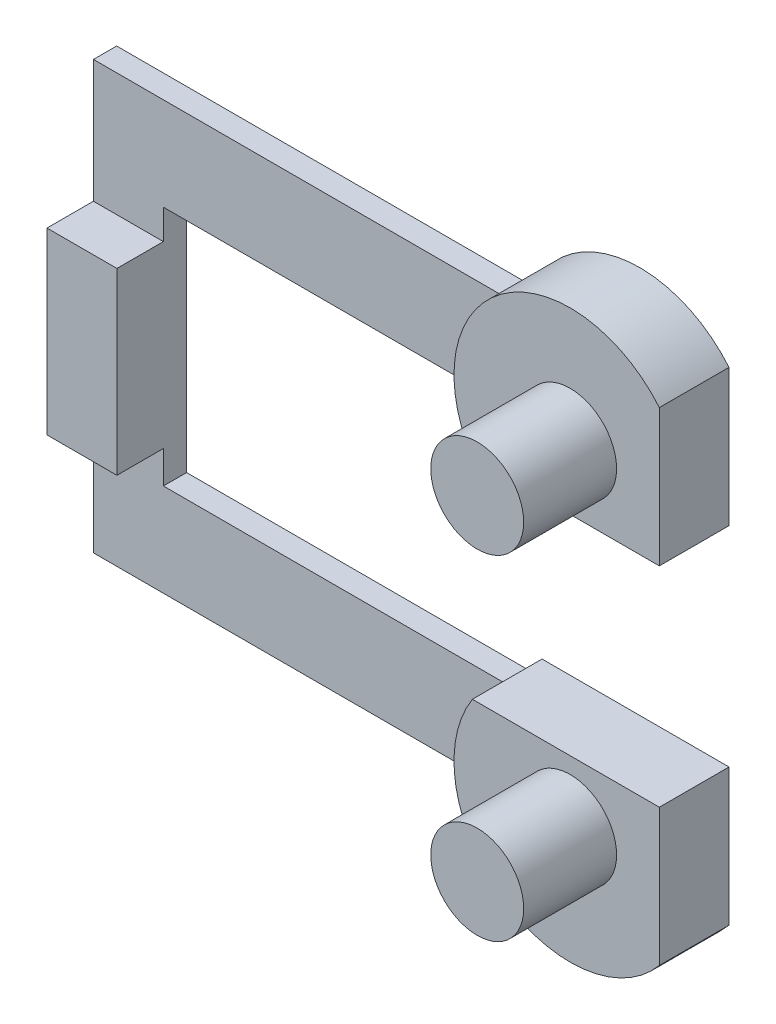
ISO-10303-21;
HEADER;
FILE_DESCRIPTION(('STEP AP214'),'2;1');
FILE_NAME('part.step','',(''),(''),'','','');
FILE_SCHEMA(('AUTOMOTIVE_DESIGN { 1 0 10303 214 1 1 1 1 }'));
ENDSEC;
DATA;
#1=APPLICATION_CONTEXT('core data for automotive mechanical design processes');
#2=APPLICATION_PROTOCOL_DEFINITION('international standard','automotive_design',2000,#1);
#3=PRODUCT_CONTEXT('',#1,'mechanical');
#4=PRODUCT('Part','Part','',(#3));
#5=PRODUCT_RELATED_PRODUCT_CATEGORY('part','',(#4));
#6=PRODUCT_DEFINITION_FORMATION('','',#4);
#7=PRODUCT_DEFINITION_CONTEXT('part definition',#1,'design');
#8=PRODUCT_DEFINITION('design','',#6,#7);
#9=PRODUCT_DEFINITION_SHAPE('','',#8);
#10=(LENGTH_UNIT() NAMED_UNIT(*) SI_UNIT(.MILLI.,.METRE.));
#11=(NAMED_UNIT(*) PLANE_ANGLE_UNIT() SI_UNIT($,.RADIAN.));
#12=(NAMED_UNIT(*) SI_UNIT($,.STERADIAN.) SOLID_ANGLE_UNIT());
#13=UNCERTAINTY_MEASURE_WITH_UNIT(LENGTH_MEASURE(1.E-05),#10,'distance_accuracy_value','');
#14=(GEOMETRIC_REPRESENTATION_CONTEXT(3) GLOBAL_UNCERTAINTY_ASSIGNED_CONTEXT((#13)) GLOBAL_UNIT_ASSIGNED_CONTEXT((#10,
#11,#12)) REPRESENTATION_CONTEXT('',''));
#15=CARTESIAN_POINT('',(0.,0.,0.));
#16=DIRECTION('',(0.,0.,1.));
#17=DIRECTION('',(1.,0.,0.));
#18=AXIS2_PLACEMENT_3D('',#15,#16,#17);
#19=CARTESIAN_POINT('',(50.1738675976098,-0.109552882352495,0.));
#20=DIRECTION('',(0.,0.,-1.));
#21=DIRECTION('',(-1.,0.,0.));
#22=AXIS2_PLACEMENT_3D('',#19,#20,#21);
#23=PLANE('',#22);
#24=DIRECTION('',(1.,0.,0.));
#25=VECTOR('',#24,1.);
#26=CARTESIAN_POINT('',(27.6498729924057,3.2883776234911,0.));
#27=LINE('',#26,#25);
#28=CARTESIAN_POINT('',(27.6498729924057,3.2883776234911,0.));
#29=VERTEX_POINT('',#28);
#30=CARTESIAN_POINT('',(30.6610472450615,3.2883776234911,0.));
#31=VERTEX_POINT('',#30);
#32=EDGE_CURVE('E624',#29,#31,#27,.T.);
#33=ORIENTED_EDGE('',*,*,#32,.F.);
#34=DIRECTION('',(0.,-1.,0.));
#35=VECTOR('',#34,1.);
#36=CARTESIAN_POINT('',(27.6498729924057,0.,0.));
#37=LINE('',#36,#35);
#38=CARTESIAN_POINT('',(27.6498729924057,-2.1095528823525,0.));
#39=VERTEX_POINT('',#38);
#40=EDGE_CURVE('E182',#29,#39,#37,.T.);
#41=ORIENTED_EDGE('',*,*,#40,.T.);
#42=DIRECTION('',(-1.,0.,0.));
#43=VECTOR('',#42,1.);
#44=CARTESIAN_POINT('',(0.,-2.1095528823525,0.));
#45=LINE('',#44,#43);
#46=CARTESIAN_POINT('',(45.5912919026539,-2.1095528823525,0.));
#47=VERTEX_POINT('',#46);
#48=EDGE_CURVE('E234',#47,#39,#45,.T.);
#49=ORIENTED_EDGE('',*,*,#48,.F.);
#50=CARTESIAN_POINT('',(50.1738675976098,-0.109552882352495,0.));
#51=DIRECTION('',(0.,0.,1.));
#52=DIRECTION('',(1.,0.,0.));
#53=AXIS2_PLACEMENT_3D('',#50,#51,#52);
#54=CIRCLE('',#53,5.);
#55=CARTESIAN_POINT('',(45.5912919026539,1.89044711764751,0.));
#56=VERTEX_POINT('',#55);
#57=EDGE_CURVE('E212',#56,#47,#54,.T.);
#58=ORIENTED_EDGE('',*,*,#57,.F.);
#59=DIRECTION('',(-1.,0.,0.));
#60=VECTOR('',#59,1.);
#61=CARTESIAN_POINT('',(0.,1.89044711764751,0.));
#62=LINE('',#61,#60);
#63=CARTESIAN_POINT('',(30.6610472450615,1.89044711764751,0.));
#64=VERTEX_POINT('',#63);
#65=EDGE_CURVE('E257',#56,#64,#62,.T.);
#66=ORIENTED_EDGE('',*,*,#65,.T.);
#67=DIRECTION('',(0.,-1.,0.));
#68=VECTOR('',#67,1.);
#69=CARTESIAN_POINT('',(30.6610472450615,0.,0.));
#70=LINE('',#69,#68);
#71=EDGE_CURVE('E253',#31,#64,#70,.T.);
#72=ORIENTED_EDGE('',*,*,#71,.F.);
#73=EDGE_LOOP('',(#33,#41,#49,#58,#66,#72));
#74=FACE_BOUND('',#73,.T.);
#75=ADVANCED_FACE('F35',(#74),#23,.F.);
#76=DIRECTION('',(-1.,0.,0.));
#77=VECTOR('',#76,1.);
#78=CARTESIAN_POINT('',(27.6498729924057,11.0026861523806,0.));
#79=LINE('',#78,#77);
#80=CARTESIAN_POINT('',(30.6610472450615,11.0026861523806,0.));
#81=VERTEX_POINT('',#80);
#82=CARTESIAN_POINT('',(27.6498729924057,11.0026861523806,0.));
#83=VERTEX_POINT('',#82);
#84=EDGE_CURVE('E176',#81,#83,#79,.T.);
#85=ORIENTED_EDGE('',*,*,#84,.F.);
#86=CARTESIAN_POINT('',(30.6610472450615,12.2869101640717,0.));
#87=VERTEX_POINT('',#86);
#88=EDGE_CURVE('E254',#87,#81,#70,.T.);
#89=ORIENTED_EDGE('',*,*,#88,.F.);
#90=DIRECTION('',(-1.,0.,0.));
#91=VECTOR('',#90,1.);
#92=CARTESIAN_POINT('',(0.,12.2869101640717,0.));
#93=LINE('',#92,#91);
#94=CARTESIAN_POINT('',(45.5928371812453,12.2869101640717,0.));
#95=VERTEX_POINT('',#94);
#96=EDGE_CURVE('E251',#95,#87,#93,.T.);
#97=ORIENTED_EDGE('',*,*,#96,.F.);
#98=CARTESIAN_POINT('',(50.1738675976098,14.2904471176475,0.));
#99=DIRECTION('',(0.,0.,1.));
#100=DIRECTION('',(1.,0.,0.));
#101=AXIS2_PLACEMENT_3D('',#98,#99,#100);
#102=CIRCLE('',#101,5.);
#103=CARTESIAN_POINT('',(45.5912919026539,16.2904471176475,0.));
#104=VERTEX_POINT('',#103);
#105=EDGE_CURVE('E222',#104,#95,#102,.T.);
#106=ORIENTED_EDGE('',*,*,#105,.F.);
#107=DIRECTION('',(-1.,0.,0.));
#108=VECTOR('',#107,1.);
#109=CARTESIAN_POINT('',(0.,16.2904471176475,0.));
#110=LINE('',#109,#108);
#111=CARTESIAN_POINT('',(27.6498729924057,16.2904471176475,0.));
#112=VERTEX_POINT('',#111);
#113=EDGE_CURVE('E249',#104,#112,#110,.T.);
#114=ORIENTED_EDGE('',*,*,#113,.T.);
#115=EDGE_CURVE('E246',#112,#83,#37,.T.);
#116=ORIENTED_EDGE('',*,*,#115,.T.);
#117=EDGE_LOOP('',(#85,#89,#97,#106,#114,#116));
#118=FACE_BOUND('',#117,.T.);
#119=ADVANCED_FACE('F373',(#118),#23,.F.);
#120=CARTESIAN_POINT('',(0.,16.2904471176475,-1.));
#121=DIRECTION('',(0.,1.,0.));
#122=DIRECTION('',(0.,0.,1.));
#123=AXIS2_PLACEMENT_3D('',#120,#121,#122);
#124=PLANE('',#123);
#125=ORIENTED_EDGE('',*,*,#113,.F.);
#126=DIRECTION('',(0.,0.,1.));
#127=VECTOR('',#126,1.);
#128=CARTESIAN_POINT('',(45.5912919026539,16.2904471176475,-1.));
#129=LINE('',#128,#127);
#130=CARTESIAN_POINT('',(45.5912919026539,16.2904471176475,-1.));
#131=VERTEX_POINT('',#130);
#132=EDGE_CURVE('E227',#104,#131,#129,.F.);
#133=ORIENTED_EDGE('',*,*,#132,.T.);
#134=DIRECTION('',(-1.,0.,0.));
#135=VECTOR('',#134,1.);
#136=CARTESIAN_POINT('',(0.,16.2904471176475,-1.));
#137=LINE('',#136,#135);
#138=CARTESIAN_POINT('',(27.6498729924057,16.2904471176475,-1.));
#139=VERTEX_POINT('',#138);
#140=EDGE_CURVE('E233',#131,#139,#137,.T.);
#141=ORIENTED_EDGE('',*,*,#140,.T.);
#142=DIRECTION('',(0.,0.,1.));
#143=VECTOR('',#142,1.);
#144=CARTESIAN_POINT('',(27.6498729924057,16.2904471176475,-1.));
#145=LINE('',#144,#143);
#146=EDGE_CURVE('E269',#139,#112,#145,.T.);
#147=ORIENTED_EDGE('',*,*,#146,.T.);
#148=EDGE_LOOP('',(#125,#133,#141,#147));
#149=FACE_BOUND('',#148,.T.);
#150=ADVANCED_FACE('F349',(#149),#124,.T.);
#151=CARTESIAN_POINT('',(0.,12.2869101640717,-1.));
#152=DIRECTION('',(0.,1.,0.));
#153=DIRECTION('',(0.,0.,1.));
#154=AXIS2_PLACEMENT_3D('',#151,#152,#153);
#155=PLANE('',#154);
#156=DIRECTION('',(0.,0.,1.));
#157=VECTOR('',#156,1.);
#158=CARTESIAN_POINT('',(45.5928371812453,12.2869101640717,-1.));
#159=LINE('',#158,#157);
#160=CARTESIAN_POINT('',(45.5928371812453,12.2869101640717,-1.));
#161=VERTEX_POINT('',#160);
#162=EDGE_CURVE('E288',#95,#161,#159,.F.);
#163=ORIENTED_EDGE('',*,*,#162,.F.);
#164=ORIENTED_EDGE('',*,*,#96,.T.);
#165=DIRECTION('',(0.,0.,1.));
#166=VECTOR('',#165,1.);
#167=CARTESIAN_POINT('',(30.6610472450615,12.2869101640717,-1.));
#168=LINE('',#167,#166);
#169=CARTESIAN_POINT('',(30.6610472450615,12.2869101640717,-1.));
#170=VERTEX_POINT('',#169);
#171=EDGE_CURVE('E266',#170,#87,#168,.T.);
#172=ORIENTED_EDGE('',*,*,#171,.F.);
#173=DIRECTION('',(-1.,0.,0.));
#174=VECTOR('',#173,1.);
#175=CARTESIAN_POINT('',(0.,12.2869101640717,-1.));
#176=LINE('',#175,#174);
#177=EDGE_CURVE('E236',#161,#170,#176,.T.);
#178=ORIENTED_EDGE('',*,*,#177,.F.);
#179=EDGE_LOOP('',(#163,#164,#172,#178));
#180=FACE_BOUND('',#179,.T.);
#181=ADVANCED_FACE('F315',(#180),#155,.F.);
#182=CARTESIAN_POINT('',(50.1738675976098,-0.109552882352495,-1.));
#183=DIRECTION('',(0.,0.,1.));
#184=DIRECTION('',(1.,0.,0.));
#185=AXIS2_PLACEMENT_3D('',#182,#183,#184);
#186=CYLINDRICAL_SURFACE('',#185,5.);
#187=CARTESIAN_POINT('',(50.1738675976098,-0.109552882352495,-1.));
#188=DIRECTION('',(0.,0.,-1.));
#189=DIRECTION('',(-1.,0.,0.));
#190=AXIS2_PLACEMENT_3D('',#187,#188,#189);
#191=CIRCLE('',#190,5.);
#192=CARTESIAN_POINT('',(54.0153048871694,-3.31007776905171,-1.));
#193=VERTEX_POINT('',#192);
#194=CARTESIAN_POINT('',(45.5912919026539,-2.1095528823525,-1.));
#195=VERTEX_POINT('',#194);
#196=EDGE_CURVE('E281',#193,#195,#191,.T.);
#197=ORIENTED_EDGE('',*,*,#196,.F.);
#198=DIRECTION('',(0.,0.,1.));
#199=VECTOR('',#198,1.);
#200=CARTESIAN_POINT('',(54.0153048871694,-3.31007776905171,-1.));
#201=LINE('',#200,#199);
#202=CARTESIAN_POINT('',(54.0153048871694,-3.3100777690517,2.));
#203=VERTEX_POINT('',#202);
#204=EDGE_CURVE('E198',#193,#203,#201,.T.);
#205=ORIENTED_EDGE('',*,*,#204,.T.);
#206=CARTESIAN_POINT('',(50.1738675976098,-0.109552882352495,2.));
#207=DIRECTION('',(0.,0.,1.));
#208=DIRECTION('',(1.,0.,0.));
#209=AXIS2_PLACEMENT_3D('',#206,#207,#208);
#210=CIRCLE('',#209,5.);
#211=CARTESIAN_POINT('',(45.9655425151096,2.59044711764751,2.));
#212=VERTEX_POINT('',#211);
#213=EDGE_CURVE('E213',#212,#203,#210,.T.);
#214=ORIENTED_EDGE('',*,*,#213,.F.);
#215=DIRECTION('',(0.,0.,1.));
#216=VECTOR('',#215,1.);
#217=CARTESIAN_POINT('',(45.9655425151096,2.59044711764751,-1.));
#218=LINE('',#217,#216);
#219=CARTESIAN_POINT('',(45.9655425151096,2.59044711764751,-1.));
#220=VERTEX_POINT('',#219);
#221=EDGE_CURVE('E203',#212,#220,#218,.F.);
#222=ORIENTED_EDGE('',*,*,#221,.T.);
#223=CARTESIAN_POINT('',(45.5912919026539,1.89044711764751,-1.));
#224=VERTEX_POINT('',#223);
#225=EDGE_CURVE('E282',#224,#220,#191,.T.);
#226=ORIENTED_EDGE('',*,*,#225,.F.);
#227=DIRECTION('',(0.,0.,1.));
#228=VECTOR('',#227,1.);
#229=CARTESIAN_POINT('',(45.5912919026539,1.89044711764751,-1.));
#230=LINE('',#229,#228);
#231=EDGE_CURVE('E278',#224,#56,#230,.T.);
#232=ORIENTED_EDGE('',*,*,#231,.T.);
#233=ORIENTED_EDGE('',*,*,#57,.T.);
#234=DIRECTION('',(0.,0.,1.));
#235=VECTOR('',#234,1.);
#236=CARTESIAN_POINT('',(45.5912919026539,-2.1095528823525,-1.));
#237=LINE('',#236,#235);
#238=EDGE_CURVE('E275',#195,#47,#237,.T.);
#239=ORIENTED_EDGE('',*,*,#238,.F.);
#240=EDGE_LOOP('',(#197,#205,#214,#222,#226,#232,#233,#239));
#241=FACE_BOUND('',#240,.T.);
#242=ADVANCED_FACE('F329',(#241),#186,.T.);
#243=CARTESIAN_POINT('',(50.1738675976098,-0.109552882352495,-1.));
#244=DIRECTION('',(0.,0.,-1.));
#245=DIRECTION('',(-1.,0.,0.));
#246=AXIS2_PLACEMENT_3D('',#243,#244,#245);
#247=PLANE('',#246);
#248=DIRECTION('',(0.,1.,0.));
#249=VECTOR('',#248,1.);
#250=CARTESIAN_POINT('',(54.0153048871694,-0.109552882352495,-1.));
#251=LINE('',#250,#249);
#252=CARTESIAN_POINT('',(54.0153048871694,2.59044711764751,-1.));
#253=VERTEX_POINT('',#252);
#254=EDGE_CURVE('E58',#193,#253,#251,.T.);
#255=ORIENTED_EDGE('',*,*,#254,.F.);
#256=ORIENTED_EDGE('',*,*,#196,.T.);
#257=DIRECTION('',(-1.,0.,0.));
#258=VECTOR('',#257,1.);
#259=CARTESIAN_POINT('',(0.,-2.1095528823525,-1.));
#260=LINE('',#259,#258);
#261=CARTESIAN_POINT('',(27.6498729924057,-2.1095528823525,-1.));
#262=VERTEX_POINT('',#261);
#263=EDGE_CURVE('E243',#195,#262,#260,.T.);
#264=ORIENTED_EDGE('',*,*,#263,.T.);
#265=DIRECTION('',(0.,-1.,0.));
#266=VECTOR('',#265,1.);
#267=CARTESIAN_POINT('',(27.6498729924057,0.,-1.));
#268=LINE('',#267,#266);
#269=EDGE_CURVE('E230',#139,#262,#268,.T.);
#270=ORIENTED_EDGE('',*,*,#269,.F.);
#271=ORIENTED_EDGE('',*,*,#140,.F.);
#272=CARTESIAN_POINT('',(50.1738675976098,14.2904471176475,-1.));
#273=DIRECTION('',(0.,0.,-1.));
#274=DIRECTION('',(-1.,0.,0.));
#275=AXIS2_PLACEMENT_3D('',#272,#273,#274);
#276=CIRCLE('',#275,5.);
#277=CARTESIAN_POINT('',(54.0153048871694,17.4909720043467,-1.));
#278=VERTEX_POINT('',#277);
#279=EDGE_CURVE('E224',#131,#278,#276,.T.);
#280=ORIENTED_EDGE('',*,*,#279,.T.);
#281=CARTESIAN_POINT('',(54.0153048871694,11.5869101640717,-1.));
#282=VERTEX_POINT('',#281);
#283=EDGE_CURVE('E191',#282,#278,#251,.T.);
#284=ORIENTED_EDGE('',*,*,#283,.F.);
#285=DIRECTION('',(1.,0.,0.));
#286=VECTOR('',#285,1.);
#287=CARTESIAN_POINT('',(50.1738675976098,11.5869101640717,-1.));
#288=LINE('',#287,#286);
#289=CARTESIAN_POINT('',(45.9678138722456,11.5869101640717,-1.));
#290=VERTEX_POINT('',#289);
#291=EDGE_CURVE('E206',#290,#282,#288,.T.);
#292=ORIENTED_EDGE('',*,*,#291,.F.);
#293=EDGE_CURVE('E228',#290,#161,#276,.T.);
#294=ORIENTED_EDGE('',*,*,#293,.T.);
#295=ORIENTED_EDGE('',*,*,#177,.T.);
#296=DIRECTION('',(0.,-1.,0.));
#297=VECTOR('',#296,1.);
#298=CARTESIAN_POINT('',(30.6610472450615,0.,-1.));
#299=LINE('',#298,#297);
#300=CARTESIAN_POINT('',(30.6610472450615,1.89044711764751,-1.));
#301=VERTEX_POINT('',#300);
#302=EDGE_CURVE('E238',#170,#301,#299,.T.);
#303=ORIENTED_EDGE('',*,*,#302,.T.);
#304=DIRECTION('',(-1.,0.,0.));
#305=VECTOR('',#304,1.);
#306=CARTESIAN_POINT('',(0.,1.89044711764751,-1.));
#307=LINE('',#306,#305);
#308=EDGE_CURVE('E241',#224,#301,#307,.T.);
#309=ORIENTED_EDGE('',*,*,#308,.F.);
#310=ORIENTED_EDGE('',*,*,#225,.T.);
#311=DIRECTION('',(-1.,0.,0.));
#312=VECTOR('',#311,1.);
#313=CARTESIAN_POINT('',(50.1738675976098,2.59044711764751,-1.));
#314=LINE('',#313,#312);
#315=EDGE_CURVE('E201',#253,#220,#314,.T.);
#316=ORIENTED_EDGE('',*,*,#315,.F.);
#317=EDGE_LOOP('',(#255,#256,#264,#270,#271,#280,#284,#292,#294,#295,#303,#309,#310,#316));
#318=FACE_BOUND('',#317,.T.);
#319=ADVANCED_FACE('F311',(#318),#247,.T.);
#320=CARTESIAN_POINT('',(0.,1.89044711764751,-1.));
#321=DIRECTION('',(0.,1.,0.));
#322=DIRECTION('',(0.,0.,1.));
#323=AXIS2_PLACEMENT_3D('',#320,#321,#322);
#324=PLANE('',#323);
#325=ORIENTED_EDGE('',*,*,#231,.F.);
#326=ORIENTED_EDGE('',*,*,#308,.T.);
#327=DIRECTION('',(0.,0.,1.));
#328=VECTOR('',#327,1.);
#329=CARTESIAN_POINT('',(30.6610472450615,1.89044711764751,-1.));
#330=LINE('',#329,#328);
#331=EDGE_CURVE('E263',#301,#64,#330,.T.);
#332=ORIENTED_EDGE('',*,*,#331,.T.);
#333=ORIENTED_EDGE('',*,*,#65,.F.);
#334=EDGE_LOOP('',(#325,#326,#332,#333));
#335=FACE_BOUND('',#334,.T.);
#336=ADVANCED_FACE('F325',(#335),#324,.T.);
#337=CARTESIAN_POINT('',(0.,-2.1095528823525,-1.));
#338=DIRECTION('',(0.,1.,0.));
#339=DIRECTION('',(0.,0.,1.));
#340=AXIS2_PLACEMENT_3D('',#337,#338,#339);
#341=PLANE('',#340);
#342=ORIENTED_EDGE('',*,*,#263,.F.);
#343=ORIENTED_EDGE('',*,*,#238,.T.);
#344=ORIENTED_EDGE('',*,*,#48,.T.);
#345=DIRECTION('',(0.,0.,1.));
#346=VECTOR('',#345,1.);
#347=CARTESIAN_POINT('',(27.6498729924057,-2.1095528823525,-1.));
#348=LINE('',#347,#346);
#349=EDGE_CURVE('E245',#262,#39,#348,.T.);
#350=ORIENTED_EDGE('',*,*,#349,.F.);
#351=EDGE_LOOP('',(#342,#343,#344,#350));
#352=FACE_BOUND('',#351,.T.);
#353=ADVANCED_FACE('F345',(#352),#341,.F.);
#354=CARTESIAN_POINT('',(27.6498729924057,0.,-1.));
#355=DIRECTION('',(-1.,0.,0.));
#356=DIRECTION('',(0.,0.,1.));
#357=AXIS2_PLACEMENT_3D('',#354,#355,#356);
#358=PLANE('',#357);
#359=ORIENTED_EDGE('',*,*,#115,.F.);
#360=ORIENTED_EDGE('',*,*,#146,.F.);
#361=ORIENTED_EDGE('',*,*,#269,.T.);
#362=ORIENTED_EDGE('',*,*,#349,.T.);
#363=ORIENTED_EDGE('',*,*,#40,.F.);
#364=DIRECTION('',(0.,0.,-1.));
#365=VECTOR('',#364,1.);
#366=CARTESIAN_POINT('',(27.6498729924057,3.2883776234911,2.));
#367=LINE('',#366,#365);
#368=CARTESIAN_POINT('',(27.6498729924057,3.2883776234911,2.));
#369=VERTEX_POINT('',#368);
#370=EDGE_CURVE('E163',#369,#29,#367,.T.);
#371=ORIENTED_EDGE('',*,*,#370,.F.);
#372=DIRECTION('',(0.,-1.,0.));
#373=VECTOR('',#372,1.);
#374=CARTESIAN_POINT('',(27.6498729924057,11.0026861523806,2.));
#375=LINE('',#374,#373);
#376=CARTESIAN_POINT('',(27.6498729924057,11.0026861523806,2.));
#377=VERTEX_POINT('',#376);
#378=EDGE_CURVE('E167',#377,#369,#375,.T.);
#379=ORIENTED_EDGE('',*,*,#378,.F.);
#380=DIRECTION('',(0.,0.,-1.));
#381=VECTOR('',#380,1.);
#382=CARTESIAN_POINT('',(27.6498729924057,11.0026861523806,2.));
#383=LINE('',#382,#381);
#384=EDGE_CURVE('E622',#377,#83,#383,.T.);
#385=ORIENTED_EDGE('',*,*,#384,.T.);
#386=EDGE_LOOP('',(#359,#360,#361,#362,#363,#371,#379,#385));
#387=FACE_BOUND('',#386,.T.);
#388=ADVANCED_FACE('F180',(#387),#358,.T.);
#389=CARTESIAN_POINT('',(30.6610472450615,0.,-1.));
#390=DIRECTION('',(-1.,0.,0.));
#391=DIRECTION('',(0.,0.,1.));
#392=AXIS2_PLACEMENT_3D('',#389,#390,#391);
#393=PLANE('',#392);
#394=ORIENTED_EDGE('',*,*,#88,.T.);
#395=DIRECTION('',(0.,0.,-1.));
#396=VECTOR('',#395,1.);
#397=CARTESIAN_POINT('',(30.6610472450615,11.0026861523806,2.));
#398=LINE('',#397,#396);
#399=CARTESIAN_POINT('',(30.6610472450615,11.0026861523806,2.));
#400=VERTEX_POINT('',#399);
#401=EDGE_CURVE('E187',#400,#81,#398,.T.);
#402=ORIENTED_EDGE('',*,*,#401,.F.);
#403=DIRECTION('',(0.,1.,0.));
#404=VECTOR('',#403,1.);
#405=CARTESIAN_POINT('',(30.6610472450615,11.0026861523806,2.));
#406=LINE('',#405,#404);
#407=CARTESIAN_POINT('',(30.6610472450615,3.2883776234911,2.));
#408=VERTEX_POINT('',#407);
#409=EDGE_CURVE('E166',#408,#400,#406,.T.);
#410=ORIENTED_EDGE('',*,*,#409,.F.);
#411=DIRECTION('',(0.,0.,-1.));
#412=VECTOR('',#411,1.);
#413=CARTESIAN_POINT('',(30.6610472450615,3.2883776234911,2.));
#414=LINE('',#413,#412);
#415=EDGE_CURVE('E50',#408,#31,#414,.T.);
#416=ORIENTED_EDGE('',*,*,#415,.T.);
#417=ORIENTED_EDGE('',*,*,#71,.T.);
#418=ORIENTED_EDGE('',*,*,#331,.F.);
#419=ORIENTED_EDGE('',*,*,#302,.F.);
#420=ORIENTED_EDGE('',*,*,#171,.T.);
#421=EDGE_LOOP('',(#394,#402,#410,#416,#417,#418,#419,#420));
#422=FACE_BOUND('',#421,.T.);
#423=ADVANCED_FACE('F320',(#422),#393,.F.);
#424=CARTESIAN_POINT('',(50.1738675976098,14.2904471176475,-1.));
#425=DIRECTION('',(0.,0.,1.));
#426=DIRECTION('',(1.,0.,0.));
#427=AXIS2_PLACEMENT_3D('',#424,#425,#426);
#428=CYLINDRICAL_SURFACE('',#427,5.);
#429=CARTESIAN_POINT('',(50.1738675976098,14.2904471176475,2.));
#430=DIRECTION('',(0.,0.,1.));
#431=DIRECTION('',(1.,0.,0.));
#432=AXIS2_PLACEMENT_3D('',#429,#430,#431);
#433=CIRCLE('',#432,5.);
#434=CARTESIAN_POINT('',(54.0153048871694,17.4909720043467,2.));
#435=VERTEX_POINT('',#434);
#436=CARTESIAN_POINT('',(45.9678138722456,11.5869101640717,2.));
#437=VERTEX_POINT('',#436);
#438=EDGE_CURVE('E219',#435,#437,#433,.T.);
#439=ORIENTED_EDGE('',*,*,#438,.F.);
#440=DIRECTION('',(0.,0.,1.));
#441=VECTOR('',#440,1.);
#442=CARTESIAN_POINT('',(54.0153048871694,17.4909720043467,-1.));
#443=LINE('',#442,#441);
#444=EDGE_CURVE('E193',#435,#278,#443,.F.);
#445=ORIENTED_EDGE('',*,*,#444,.T.);
#446=ORIENTED_EDGE('',*,*,#279,.F.);
#447=ORIENTED_EDGE('',*,*,#132,.F.);
#448=ORIENTED_EDGE('',*,*,#105,.T.);
#449=ORIENTED_EDGE('',*,*,#162,.T.);
#450=ORIENTED_EDGE('',*,*,#293,.F.);
#451=DIRECTION('',(0.,0.,1.));
#452=VECTOR('',#451,1.);
#453=CARTESIAN_POINT('',(45.9678138722456,11.5869101640717,-1.));
#454=LINE('',#453,#452);
#455=EDGE_CURVE('E209',#290,#437,#454,.T.);
#456=ORIENTED_EDGE('',*,*,#455,.T.);
#457=EDGE_LOOP('',(#439,#445,#446,#447,#448,#449,#450,#456));
#458=FACE_BOUND('',#457,.T.);
#459=ADVANCED_FACE('F307',(#458),#428,.T.);
#460=CARTESIAN_POINT('',(50.1738675976098,14.2904471176475,2.));
#461=DIRECTION('',(0.,0.,1.));
#462=DIRECTION('',(1.,0.,0.));
#463=AXIS2_PLACEMENT_3D('',#460,#461,#462);
#464=PLANE('',#463);
#465=DIRECTION('',(0.,-1.,0.));
#466=VECTOR('',#465,1.);
#467=CARTESIAN_POINT('',(54.0153048871694,18.5720307849715,2.));
#468=LINE('',#467,#466);
#469=CARTESIAN_POINT('',(54.0153048871694,11.5869101640717,2.));
#470=VERTEX_POINT('',#469);
#471=EDGE_CURVE('E185',#435,#470,#468,.T.);
#472=ORIENTED_EDGE('',*,*,#471,.F.);
#473=ORIENTED_EDGE('',*,*,#438,.T.);
#474=DIRECTION('',(-1.,0.,0.));
#475=VECTOR('',#474,1.);
#476=CARTESIAN_POINT('',(50.1738675976098,11.5869101640717,2.));
#477=LINE('',#476,#475);
#478=EDGE_CURVE('E43',#470,#437,#477,.T.);
#479=ORIENTED_EDGE('',*,*,#478,.F.);
#480=EDGE_LOOP('',(#472,#473,#479));
#481=FACE_BOUND('',#480,.T.);
#482=CARTESIAN_POINT('',(50.1738675976098,14.2904471176475,2.));
#483=DIRECTION('',(0.,0.,1.));
#484=DIRECTION('',(1.,0.,0.));
#485=AXIS2_PLACEMENT_3D('',#482,#483,#484);
#486=CIRCLE('',#485,2.);
#487=CARTESIAN_POINT('',(52.1738675976098,14.2904471176475,2.));
#488=VERTEX_POINT('',#487);
#489=EDGE_CURVE('E221',#488,#488,#486,.T.);
#490=ORIENTED_EDGE('',*,*,#489,.F.);
#491=EDGE_LOOP('',(#490));
#492=FACE_BOUND('',#491,.T.);
#493=ADVANCED_FACE('F354',(#481,#492),#464,.T.);
#494=CARTESIAN_POINT('',(50.1738675976098,14.2904471176475,6.));
#495=DIRECTION('',(0.,0.,1.));
#496=DIRECTION('',(1.,0.,0.));
#497=AXIS2_PLACEMENT_3D('',#494,#495,#496);
#498=PLANE('',#497);
#499=CARTESIAN_POINT('',(50.1738675976098,14.2904471176475,6.));
#500=DIRECTION('',(0.,0.,1.));
#501=DIRECTION('',(1.,0.,0.));
#502=AXIS2_PLACEMENT_3D('',#499,#500,#501);
#503=CIRCLE('',#502,2.);
#504=CARTESIAN_POINT('',(52.1738675976098,14.2904471176475,6.));
#505=VERTEX_POINT('',#504);
#506=EDGE_CURVE('E272',#505,#505,#503,.T.);
#507=ORIENTED_EDGE('',*,*,#506,.T.);
#508=EDGE_LOOP('',(#507));
#509=FACE_BOUND('',#508,.T.);
#510=ADVANCED_FACE('F357',(#509),#498,.T.);
#511=CARTESIAN_POINT('',(50.1738675976098,14.2904471176475,6.));
#512=DIRECTION('',(0.,0.,-1.));
#513=DIRECTION('',(-1.,0.,0.));
#514=AXIS2_PLACEMENT_3D('',#511,#512,#513);
#515=CYLINDRICAL_SURFACE('',#514,2.);
#516=ORIENTED_EDGE('',*,*,#489,.T.);
#517=EDGE_LOOP('',(#516));
#518=FACE_BOUND('',#517,.T.);
#519=ORIENTED_EDGE('',*,*,#506,.F.);
#520=EDGE_LOOP('',(#519));
#521=FACE_BOUND('',#520,.T.);
#522=ADVANCED_FACE('F361',(#518,#521),#515,.T.);
#523=CARTESIAN_POINT('',(50.1738675976098,-0.109552882352495,2.));
#524=DIRECTION('',(0.,0.,1.));
#525=DIRECTION('',(1.,0.,0.));
#526=AXIS2_PLACEMENT_3D('',#523,#524,#525);
#527=PLANE('',#526);
#528=CARTESIAN_POINT('',(54.0153048871694,2.59044711764751,2.));
#529=VERTEX_POINT('',#528);
#530=EDGE_CURVE('E183',#529,#203,#468,.T.);
#531=ORIENTED_EDGE('',*,*,#530,.F.);
#532=DIRECTION('',(1.,0.,0.));
#533=VECTOR('',#532,1.);
#534=CARTESIAN_POINT('',(50.1738675976098,2.59044711764751,2.));
#535=LINE('',#534,#533);
#536=EDGE_CURVE('E291',#212,#529,#535,.T.);
#537=ORIENTED_EDGE('',*,*,#536,.F.);
#538=ORIENTED_EDGE('',*,*,#213,.T.);
#539=EDGE_LOOP('',(#531,#537,#538));
#540=FACE_BOUND('',#539,.T.);
#541=CARTESIAN_POINT('',(50.1738675976098,-0.109552882352495,2.));
#542=DIRECTION('',(0.,0.,1.));
#543=DIRECTION('',(1.,0.,0.));
#544=AXIS2_PLACEMENT_3D('',#541,#542,#543);
#545=CIRCLE('',#544,2.);
#546=CARTESIAN_POINT('',(52.1738675976098,-0.109552882352495,2.));
#547=VERTEX_POINT('',#546);
#548=EDGE_CURVE('E216',#547,#547,#545,.T.);
#549=ORIENTED_EDGE('',*,*,#548,.F.);
#550=EDGE_LOOP('',(#549));
#551=FACE_BOUND('',#550,.T.);
#552=ADVANCED_FACE('F337',(#540,#551),#527,.T.);
#553=CARTESIAN_POINT('',(50.1738675976098,-0.109552882352495,6.));
#554=DIRECTION('',(0.,0.,1.));
#555=DIRECTION('',(1.,0.,0.));
#556=AXIS2_PLACEMENT_3D('',#553,#554,#555);
#557=PLANE('',#556);
#558=CARTESIAN_POINT('',(50.1738675976098,-0.109552882352495,6.));
#559=DIRECTION('',(0.,0.,1.));
#560=DIRECTION('',(1.,0.,0.));
#561=AXIS2_PLACEMENT_3D('',#558,#559,#560);
#562=CIRCLE('',#561,2.);
#563=CARTESIAN_POINT('',(52.1738675976098,-0.109552882352495,6.));
#564=VERTEX_POINT('',#563);
#565=EDGE_CURVE('E285',#564,#564,#562,.T.);
#566=ORIENTED_EDGE('',*,*,#565,.T.);
#567=EDGE_LOOP('',(#566));
#568=FACE_BOUND('',#567,.T.);
#569=ADVANCED_FACE('F384',(#568),#557,.T.);
#570=CARTESIAN_POINT('',(50.1738675976098,-0.109552882352495,6.));
#571=DIRECTION('',(0.,0.,-1.));
#572=DIRECTION('',(-1.,0.,0.));
#573=AXIS2_PLACEMENT_3D('',#570,#571,#572);
#574=CYLINDRICAL_SURFACE('',#573,2.);
#575=ORIENTED_EDGE('',*,*,#548,.T.);
#576=EDGE_LOOP('',(#575));
#577=FACE_BOUND('',#576,.T.);
#578=ORIENTED_EDGE('',*,*,#565,.F.);
#579=EDGE_LOOP('',(#578));
#580=FACE_BOUND('',#579,.T.);
#581=ADVANCED_FACE('F37',(#577,#580),#574,.T.);
#582=CARTESIAN_POINT('',(43.6610472450615,2.59044711764751,-2.8));
#583=DIRECTION('',(0.,-1.,0.));
#584=DIRECTION('',(0.,0.,-1.));
#585=AXIS2_PLACEMENT_3D('',#582,#583,#584);
#586=PLANE('',#585);
#587=ORIENTED_EDGE('',*,*,#536,.T.);
#588=DIRECTION('',(0.,0.,-1.));
#589=VECTOR('',#588,1.);
#590=CARTESIAN_POINT('',(54.0153048871694,2.59044711764751,-2.8));
#591=LINE('',#590,#589);
#592=EDGE_CURVE('E196',#529,#253,#591,.T.);
#593=ORIENTED_EDGE('',*,*,#592,.T.);
#594=ORIENTED_EDGE('',*,*,#315,.T.);
#595=ORIENTED_EDGE('',*,*,#221,.F.);
#596=EDGE_LOOP('',(#587,#593,#594,#595));
#597=FACE_BOUND('',#596,.T.);
#598=ADVANCED_FACE('F334',(#597),#586,.F.);
#599=CARTESIAN_POINT('',(43.6610472450615,11.5869101640717,-2.8));
#600=DIRECTION('',(0.,1.,0.));
#601=DIRECTION('',(0.,0.,1.));
#602=AXIS2_PLACEMENT_3D('',#599,#600,#601);
#603=PLANE('',#602);
#604=ORIENTED_EDGE('',*,*,#291,.T.);
#605=DIRECTION('',(0.,0.,1.));
#606=VECTOR('',#605,1.);
#607=CARTESIAN_POINT('',(54.0153048871694,11.5869101640717,-2.8));
#608=LINE('',#607,#606);
#609=EDGE_CURVE('E11',#282,#470,#608,.T.);
#610=ORIENTED_EDGE('',*,*,#609,.T.);
#611=ORIENTED_EDGE('',*,*,#478,.T.);
#612=ORIENTED_EDGE('',*,*,#455,.F.);
#613=EDGE_LOOP('',(#604,#610,#611,#612));
#614=FACE_BOUND('',#613,.T.);
#615=ADVANCED_FACE('F300',(#614),#603,.F.);
#616=CARTESIAN_POINT('',(54.0153048871694,18.5720307849715,-2.8));
#617=DIRECTION('',(-1.,0.,0.));
#618=DIRECTION('',(0.,0.,1.));
#619=AXIS2_PLACEMENT_3D('',#616,#617,#618);
#620=PLANE('',#619);
#621=ORIENTED_EDGE('',*,*,#471,.T.);
#622=ORIENTED_EDGE('',*,*,#609,.F.);
#623=ORIENTED_EDGE('',*,*,#283,.T.);
#624=ORIENTED_EDGE('',*,*,#444,.F.);
#625=EDGE_LOOP('',(#621,#622,#623,#624));
#626=FACE_BOUND('',#625,.T.);
#627=ADVANCED_FACE('F353',(#626),#620,.F.);
#628=ORIENTED_EDGE('',*,*,#254,.T.);
#629=ORIENTED_EDGE('',*,*,#592,.F.);
#630=ORIENTED_EDGE('',*,*,#530,.T.);
#631=ORIENTED_EDGE('',*,*,#204,.F.);
#632=EDGE_LOOP('',(#628,#629,#630,#631));
#633=FACE_BOUND('',#632,.T.);
#634=ADVANCED_FACE('F339',(#633),#620,.F.);
#635=CARTESIAN_POINT('',(27.6498729924057,3.2883776234911,2.));
#636=DIRECTION('',(0.,1.,0.));
#637=DIRECTION('',(0.,0.,1.));
#638=AXIS2_PLACEMENT_3D('',#635,#636,#637);
#639=PLANE('',#638);
#640=ORIENTED_EDGE('',*,*,#32,.T.);
#641=ORIENTED_EDGE('',*,*,#415,.F.);
#642=DIRECTION('',(1.,0.,0.));
#643=VECTOR('',#642,1.);
#644=CARTESIAN_POINT('',(27.6498729924057,3.2883776234911,2.));
#645=LINE('',#644,#643);
#646=EDGE_CURVE('E159',#369,#408,#645,.T.);
#647=ORIENTED_EDGE('',*,*,#646,.F.);
#648=ORIENTED_EDGE('',*,*,#370,.T.);
#649=EDGE_LOOP('',(#640,#641,#647,#648));
#650=FACE_BOUND('',#649,.T.);
#651=ADVANCED_FACE('F161',(#650),#639,.F.);
#652=CARTESIAN_POINT('',(27.6498729924057,11.0026861523806,2.));
#653=DIRECTION('',(0.,-1.,0.));
#654=DIRECTION('',(0.,0.,-1.));
#655=AXIS2_PLACEMENT_3D('',#652,#653,#654);
#656=PLANE('',#655);
#657=ORIENTED_EDGE('',*,*,#84,.T.);
#658=ORIENTED_EDGE('',*,*,#384,.F.);
#659=DIRECTION('',(-1.,0.,0.));
#660=VECTOR('',#659,1.);
#661=CARTESIAN_POINT('',(27.6498729924057,11.0026861523806,2.));
#662=LINE('',#661,#660);
#663=EDGE_CURVE('E172',#400,#377,#662,.T.);
#664=ORIENTED_EDGE('',*,*,#663,.F.);
#665=ORIENTED_EDGE('',*,*,#401,.T.);
#666=EDGE_LOOP('',(#657,#658,#664,#665));
#667=FACE_BOUND('',#666,.T.);
#668=ADVANCED_FACE('F428',(#667),#656,.F.);
#669=CARTESIAN_POINT('',(0.,0.,2.));
#670=DIRECTION('',(0.,0.,1.));
#671=DIRECTION('',(1.,0.,0.));
#672=AXIS2_PLACEMENT_3D('',#669,#670,#671);
#673=PLANE('',#672);
#674=ORIENTED_EDGE('',*,*,#378,.T.);
#675=ORIENTED_EDGE('',*,*,#646,.T.);
#676=ORIENTED_EDGE('',*,*,#409,.T.);
#677=ORIENTED_EDGE('',*,*,#663,.T.);
#678=EDGE_LOOP('',(#674,#675,#676,#677));
#679=FACE_BOUND('',#678,.T.);
#680=ADVANCED_FACE('F170',(#679),#673,.T.);
#681=CLOSED_SHELL('',(#75,#119,#150,#181,#242,#319,#336,#353,#388,#423,#459,#493,#510,#522,#552,
#569,#581,#598,#615,#627,#634,#651,#668,#680));
#682=MANIFOLD_SOLID_BREP('B2',#681);
#683=ADVANCED_BREP_SHAPE_REPRESENTATION('',(#18,#682),#14);
#684=SHAPE_DEFINITION_REPRESENTATION(#9,#683);
ENDSEC;
END-ISO-10303-21;
